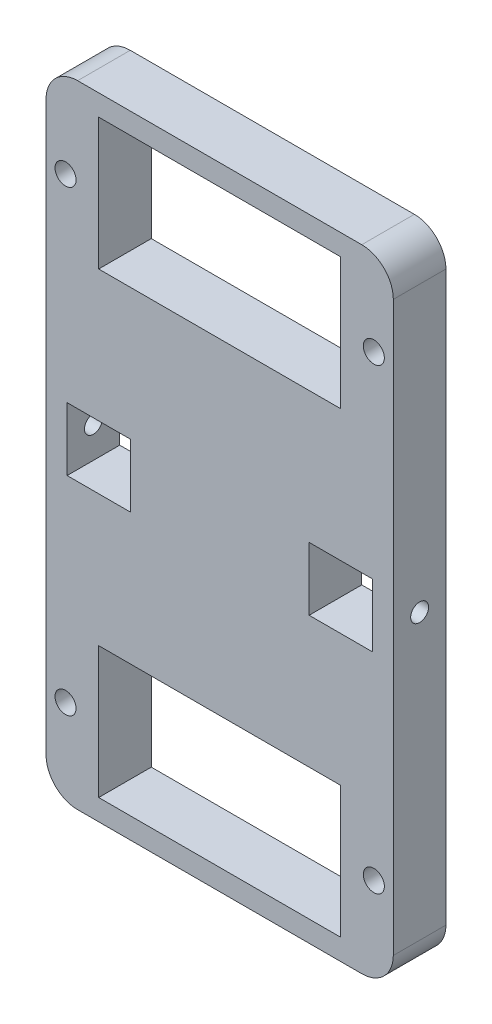
ISO-10303-21;
HEADER;
FILE_DESCRIPTION(('STEP AP214'),'2;1');
FILE_NAME('part.step','',(''),(''),'','','');
FILE_SCHEMA(('AUTOMOTIVE_DESIGN { 1 0 10303 214 1 1 1 1 }'));
ENDSEC;
DATA;
#1=APPLICATION_CONTEXT('core data for automotive mechanical design processes');
#2=APPLICATION_PROTOCOL_DEFINITION('international standard','automotive_design',2000,#1);
#3=PRODUCT_CONTEXT('',#1,'mechanical');
#4=PRODUCT('Part','Part','',(#3));
#5=PRODUCT_RELATED_PRODUCT_CATEGORY('part','',(#4));
#6=PRODUCT_DEFINITION_FORMATION('','',#4);
#7=PRODUCT_DEFINITION_CONTEXT('part definition',#1,'design');
#8=PRODUCT_DEFINITION('design','',#6,#7);
#9=PRODUCT_DEFINITION_SHAPE('','',#8);
#10=(LENGTH_UNIT() NAMED_UNIT(*) SI_UNIT(.MILLI.,.METRE.));
#11=(NAMED_UNIT(*) PLANE_ANGLE_UNIT() SI_UNIT($,.RADIAN.));
#12=(NAMED_UNIT(*) SI_UNIT($,.STERADIAN.) SOLID_ANGLE_UNIT());
#13=UNCERTAINTY_MEASURE_WITH_UNIT(LENGTH_MEASURE(1.E-05),#10,'distance_accuracy_value','');
#14=(GEOMETRIC_REPRESENTATION_CONTEXT(3) GLOBAL_UNCERTAINTY_ASSIGNED_CONTEXT((#13)) GLOBAL_UNIT_ASSIGNED_CONTEXT((#10,
#11,#12)) REPRESENTATION_CONTEXT('',''));
#15=CARTESIAN_POINT('',(0.,0.,0.));
#16=DIRECTION('',(0.,0.,1.));
#17=DIRECTION('',(1.,0.,0.));
#18=AXIS2_PLACEMENT_3D('',#15,#16,#17);
#19=CARTESIAN_POINT('',(0.,0.,5.));
#20=DIRECTION('',(0.,0.,-1.));
#21=DIRECTION('',(-1.,0.,0.));
#22=AXIS2_PLACEMENT_3D('',#19,#20,#21);
#23=PLANE('',#22);
#24=DIRECTION('',(0.,1.,0.));
#25=VECTOR('',#24,1.);
#26=CARTESIAN_POINT('',(-8.5,-3.,5.));
#27=LINE('',#26,#25);
#28=CARTESIAN_POINT('',(-8.5,-3.,5.));
#29=VERTEX_POINT('',#28);
#30=CARTESIAN_POINT('',(-8.5,3.,5.));
#31=VERTEX_POINT('',#30);
#32=EDGE_CURVE('E258',#29,#31,#27,.T.);
#33=ORIENTED_EDGE('',*,*,#32,.F.);
#34=DIRECTION('',(1.,0.,0.));
#35=VECTOR('',#34,1.);
#36=CARTESIAN_POINT('',(-14.5,-3.,5.));
#37=LINE('',#36,#35);
#38=CARTESIAN_POINT('',(-14.5,-3.,5.));
#39=VERTEX_POINT('',#38);
#40=EDGE_CURVE('E269',#39,#29,#37,.T.);
#41=ORIENTED_EDGE('',*,*,#40,.F.);
#42=DIRECTION('',(0.,-1.,0.));
#43=VECTOR('',#42,1.);
#44=CARTESIAN_POINT('',(-14.5,-3.,5.));
#45=LINE('',#44,#43);
#46=CARTESIAN_POINT('',(-14.5,3.,5.));
#47=VERTEX_POINT('',#46);
#48=EDGE_CURVE('E265',#47,#39,#45,.T.);
#49=ORIENTED_EDGE('',*,*,#48,.F.);
#50=DIRECTION('',(-1.,0.,0.));
#51=VECTOR('',#50,1.);
#52=CARTESIAN_POINT('',(-14.5,3.,5.));
#53=LINE('',#52,#51);
#54=EDGE_CURVE('E261',#31,#47,#53,.T.);
#55=ORIENTED_EDGE('',*,*,#54,.F.);
#56=EDGE_LOOP('',(#33,#41,#49,#55));
#57=FACE_BOUND('',#56,.T.);
#58=DIRECTION('',(0.,1.,0.));
#59=VECTOR('',#58,1.);
#60=CARTESIAN_POINT('',(11.5,28.,5.));
#61=LINE('',#60,#59);
#62=CARTESIAN_POINT('',(11.5,15.5,5.));
#63=VERTEX_POINT('',#62);
#64=CARTESIAN_POINT('',(11.5,28.,5.));
#65=VERTEX_POINT('',#64);
#66=EDGE_CURVE('E376',#63,#65,#61,.T.);
#67=ORIENTED_EDGE('',*,*,#66,.F.);
#68=DIRECTION('',(1.,0.,0.));
#69=VECTOR('',#68,1.);
#70=CARTESIAN_POINT('',(-11.5,15.5,5.));
#71=LINE('',#70,#69);
#72=CARTESIAN_POINT('',(-11.5,15.5,5.));
#73=VERTEX_POINT('',#72);
#74=EDGE_CURVE('E387',#73,#63,#71,.T.);
#75=ORIENTED_EDGE('',*,*,#74,.F.);
#76=DIRECTION('',(0.,-1.,0.));
#77=VECTOR('',#76,1.);
#78=CARTESIAN_POINT('',(-11.5,28.,5.));
#79=LINE('',#78,#77);
#80=CARTESIAN_POINT('',(-11.5,28.,5.));
#81=VERTEX_POINT('',#80);
#82=EDGE_CURVE('E383',#81,#73,#79,.T.);
#83=ORIENTED_EDGE('',*,*,#82,.F.);
#84=DIRECTION('',(-1.,0.,0.));
#85=VECTOR('',#84,1.);
#86=CARTESIAN_POINT('',(-11.5,28.,5.));
#87=LINE('',#86,#85);
#88=EDGE_CURVE('E379',#65,#81,#87,.T.);
#89=ORIENTED_EDGE('',*,*,#88,.F.);
#90=EDGE_LOOP('',(#67,#75,#83,#89));
#91=FACE_BOUND('',#90,.T.);
#92=DIRECTION('',(1.,0.,0.));
#93=VECTOR('',#92,1.);
#94=CARTESIAN_POINT('',(-16.5,-30.,5.));
#95=LINE('',#94,#93);
#96=CARTESIAN_POINT('',(-13.5,-30.,5.));
#97=VERTEX_POINT('',#96);
#98=CARTESIAN_POINT('',(13.5,-30.,5.));
#99=VERTEX_POINT('',#98);
#100=EDGE_CURVE('E430',#97,#99,#95,.T.);
#101=ORIENTED_EDGE('',*,*,#100,.T.);
#102=CARTESIAN_POINT('',(13.5,-27.,5.));
#103=DIRECTION('',(0.,0.,-1.));
#104=DIRECTION('',(-1.,0.,0.));
#105=AXIS2_PLACEMENT_3D('',#102,#103,#104);
#106=CIRCLE('',#105,3.);
#107=CARTESIAN_POINT('',(16.5,-27.,5.));
#108=VERTEX_POINT('',#107);
#109=EDGE_CURVE('E490',#99,#108,#106,.F.);
#110=ORIENTED_EDGE('',*,*,#109,.T.);
#111=DIRECTION('',(0.,1.,0.));
#112=VECTOR('',#111,1.);
#113=CARTESIAN_POINT('',(16.5,-30.,5.));
#114=LINE('',#113,#112);
#115=CARTESIAN_POINT('',(16.5,27.,5.));
#116=VERTEX_POINT('',#115);
#117=EDGE_CURVE('E419',#108,#116,#114,.T.);
#118=ORIENTED_EDGE('',*,*,#117,.T.);
#119=CARTESIAN_POINT('',(13.5,27.,5.));
#120=DIRECTION('',(0.,0.,-1.));
#121=DIRECTION('',(-1.,0.,0.));
#122=AXIS2_PLACEMENT_3D('',#119,#120,#121);
#123=CIRCLE('',#122,3.);
#124=CARTESIAN_POINT('',(13.5,30.,5.));
#125=VERTEX_POINT('',#124);
#126=EDGE_CURVE('E487',#116,#125,#123,.F.);
#127=ORIENTED_EDGE('',*,*,#126,.T.);
#128=DIRECTION('',(-1.,0.,0.));
#129=VECTOR('',#128,1.);
#130=CARTESIAN_POINT('',(-16.5,30.,5.));
#131=LINE('',#130,#129);
#132=CARTESIAN_POINT('',(-13.5,30.,5.));
#133=VERTEX_POINT('',#132);
#134=EDGE_CURVE('E423',#125,#133,#131,.T.);
#135=ORIENTED_EDGE('',*,*,#134,.T.);
#136=CARTESIAN_POINT('',(-13.5,27.,5.));
#137=DIRECTION('',(0.,0.,-1.));
#138=DIRECTION('',(-1.,0.,0.));
#139=AXIS2_PLACEMENT_3D('',#136,#137,#138);
#140=CIRCLE('',#139,3.);
#141=CARTESIAN_POINT('',(-16.5,27.,5.));
#142=VERTEX_POINT('',#141);
#143=EDGE_CURVE('E61',#133,#142,#140,.F.);
#144=ORIENTED_EDGE('',*,*,#143,.T.);
#145=DIRECTION('',(0.,-1.,0.));
#146=VECTOR('',#145,1.);
#147=CARTESIAN_POINT('',(-16.5,-30.,5.));
#148=LINE('',#147,#146);
#149=CARTESIAN_POINT('',(-16.5,-27.,5.));
#150=VERTEX_POINT('',#149);
#151=EDGE_CURVE('E427',#142,#150,#148,.T.);
#152=ORIENTED_EDGE('',*,*,#151,.T.);
#153=CARTESIAN_POINT('',(-13.5,-27.,5.));
#154=DIRECTION('',(0.,0.,-1.));
#155=DIRECTION('',(-1.,0.,0.));
#156=AXIS2_PLACEMENT_3D('',#153,#154,#155);
#157=CIRCLE('',#156,3.);
#158=EDGE_CURVE('E482',#150,#97,#157,.F.);
#159=ORIENTED_EDGE('',*,*,#158,.T.);
#160=EDGE_LOOP('',(#101,#110,#118,#127,#135,#144,#152,#159));
#161=FACE_BOUND('',#160,.T.);
#162=DIRECTION('',(0.,-1.,0.));
#163=VECTOR('',#162,1.);
#164=CARTESIAN_POINT('',(-11.5,-28.,5.));
#165=LINE('',#164,#163);
#166=CARTESIAN_POINT('',(-11.5,-15.5,5.));
#167=VERTEX_POINT('',#166);
#168=CARTESIAN_POINT('',(-11.5,-28.,5.));
#169=VERTEX_POINT('',#168);
#170=EDGE_CURVE('E333',#167,#169,#165,.T.);
#171=ORIENTED_EDGE('',*,*,#170,.F.);
#172=DIRECTION('',(-1.,0.,0.));
#173=VECTOR('',#172,1.);
#174=CARTESIAN_POINT('',(-11.5,-15.5,5.));
#175=LINE('',#174,#173);
#176=CARTESIAN_POINT('',(11.5,-15.5,5.));
#177=VERTEX_POINT('',#176);
#178=EDGE_CURVE('E344',#177,#167,#175,.T.);
#179=ORIENTED_EDGE('',*,*,#178,.F.);
#180=DIRECTION('',(0.,1.,0.));
#181=VECTOR('',#180,1.);
#182=CARTESIAN_POINT('',(11.5,-28.,5.));
#183=LINE('',#182,#181);
#184=CARTESIAN_POINT('',(11.5,-28.,5.));
#185=VERTEX_POINT('',#184);
#186=EDGE_CURVE('E340',#185,#177,#183,.T.);
#187=ORIENTED_EDGE('',*,*,#186,.F.);
#188=DIRECTION('',(1.,0.,0.));
#189=VECTOR('',#188,1.);
#190=CARTESIAN_POINT('',(-11.5,-28.,5.));
#191=LINE('',#190,#189);
#192=EDGE_CURVE('E336',#169,#185,#191,.T.);
#193=ORIENTED_EDGE('',*,*,#192,.F.);
#194=EDGE_LOOP('',(#171,#179,#187,#193));
#195=FACE_BOUND('',#194,.T.);
#196=CARTESIAN_POINT('',(-14.65,21.75,5.));
#197=DIRECTION('',(0.,0.,1.));
#198=DIRECTION('',(1.,0.,0.));
#199=AXIS2_PLACEMENT_3D('',#196,#197,#198);
#200=CIRCLE('',#199,1.);
#201=CARTESIAN_POINT('',(-13.65,21.75,5.));
#202=VERTEX_POINT('',#201);
#203=EDGE_CURVE('E325',#202,#202,#200,.T.);
#204=ORIENTED_EDGE('',*,*,#203,.F.);
#205=EDGE_LOOP('',(#204));
#206=FACE_BOUND('',#205,.T.);
#207=CARTESIAN_POINT('',(14.65,21.75,5.));
#208=DIRECTION('',(0.,0.,1.));
#209=DIRECTION('',(-1.,0.,0.));
#210=AXIS2_PLACEMENT_3D('',#207,#208,#209);
#211=CIRCLE('',#210,1.);
#212=CARTESIAN_POINT('',(13.65,21.75,5.));
#213=VERTEX_POINT('',#212);
#214=EDGE_CURVE('E317',#213,#213,#211,.T.);
#215=ORIENTED_EDGE('',*,*,#214,.F.);
#216=EDGE_LOOP('',(#215));
#217=FACE_BOUND('',#216,.T.);
#218=CARTESIAN_POINT('',(14.65,-21.75,5.));
#219=DIRECTION('',(0.,0.,1.));
#220=DIRECTION('',(1.,0.,0.));
#221=AXIS2_PLACEMENT_3D('',#218,#219,#220);
#222=CIRCLE('',#221,1.);
#223=CARTESIAN_POINT('',(15.65,-21.75,5.));
#224=VERTEX_POINT('',#223);
#225=EDGE_CURVE('E309',#224,#224,#222,.T.);
#226=ORIENTED_EDGE('',*,*,#225,.F.);
#227=EDGE_LOOP('',(#226));
#228=FACE_BOUND('',#227,.T.);
#229=CARTESIAN_POINT('',(-14.65,-21.75,5.));
#230=DIRECTION('',(0.,0.,1.));
#231=DIRECTION('',(-1.,0.,0.));
#232=AXIS2_PLACEMENT_3D('',#229,#230,#231);
#233=CIRCLE('',#232,1.);
#234=CARTESIAN_POINT('',(-15.65,-21.75,5.));
#235=VERTEX_POINT('',#234);
#236=EDGE_CURVE('E301',#235,#235,#233,.T.);
#237=ORIENTED_EDGE('',*,*,#236,.F.);
#238=EDGE_LOOP('',(#237));
#239=FACE_BOUND('',#238,.T.);
#240=DIRECTION('',(0.,1.,0.));
#241=VECTOR('',#240,1.);
#242=CARTESIAN_POINT('',(14.5,-3.,5.));
#243=LINE('',#242,#241);
#244=CARTESIAN_POINT('',(14.5,-3.,5.));
#245=VERTEX_POINT('',#244);
#246=CARTESIAN_POINT('',(14.5,3.,5.));
#247=VERTEX_POINT('',#246);
#248=EDGE_CURVE('E203',#245,#247,#243,.T.);
#249=ORIENTED_EDGE('',*,*,#248,.F.);
#250=DIRECTION('',(1.,0.,0.));
#251=VECTOR('',#250,1.);
#252=CARTESIAN_POINT('',(14.5,-3.,5.));
#253=LINE('',#252,#251);
#254=CARTESIAN_POINT('',(8.50000000000001,-3.,5.));
#255=VERTEX_POINT('',#254);
#256=EDGE_CURVE('E232',#255,#245,#253,.T.);
#257=ORIENTED_EDGE('',*,*,#256,.F.);
#258=DIRECTION('',(0.,-1.,0.));
#259=VECTOR('',#258,1.);
#260=CARTESIAN_POINT('',(8.50000000000001,-3.,5.));
#261=LINE('',#260,#259);
#262=CARTESIAN_POINT('',(8.50000000000001,3.,5.));
#263=VERTEX_POINT('',#262);
#264=EDGE_CURVE('E228',#263,#255,#261,.T.);
#265=ORIENTED_EDGE('',*,*,#264,.F.);
#266=DIRECTION('',(-1.,0.,0.));
#267=VECTOR('',#266,1.);
#268=CARTESIAN_POINT('',(14.5,3.,5.));
#269=LINE('',#268,#267);
#270=EDGE_CURVE('E214',#247,#263,#269,.T.);
#271=ORIENTED_EDGE('',*,*,#270,.F.);
#272=EDGE_LOOP('',(#249,#257,#265,#271));
#273=FACE_BOUND('',#272,.T.);
#274=ADVANCED_FACE('F39',(#57,#91,#161,#195,#206,#217,#228,#239,#273),#23,.F.);
#275=CARTESIAN_POINT('',(0.,0.,0.));
#276=DIRECTION('',(0.,0.,-1.));
#277=DIRECTION('',(-1.,0.,0.));
#278=AXIS2_PLACEMENT_3D('',#275,#276,#277);
#279=PLANE('',#278);
#280=CARTESIAN_POINT('',(14.65,-21.75,0.));
#281=DIRECTION('',(0.,0.,1.));
#282=DIRECTION('',(1.,0.,0.));
#283=AXIS2_PLACEMENT_3D('',#280,#281,#282);
#284=CIRCLE('',#283,1.);
#285=CARTESIAN_POINT('',(15.65,-21.75,0.));
#286=VERTEX_POINT('',#285);
#287=EDGE_CURVE('E305',#286,#286,#284,.T.);
#288=ORIENTED_EDGE('',*,*,#287,.T.);
#289=EDGE_LOOP('',(#288));
#290=FACE_BOUND('',#289,.T.);
#291=CARTESIAN_POINT('',(-14.65,21.75,0.));
#292=DIRECTION('',(0.,0.,1.));
#293=DIRECTION('',(1.,0.,0.));
#294=AXIS2_PLACEMENT_3D('',#291,#292,#293);
#295=CIRCLE('',#294,1.);
#296=CARTESIAN_POINT('',(-13.65,21.75,0.));
#297=VERTEX_POINT('',#296);
#298=EDGE_CURVE('E321',#297,#297,#295,.T.);
#299=ORIENTED_EDGE('',*,*,#298,.T.);
#300=EDGE_LOOP('',(#299));
#301=FACE_BOUND('',#300,.T.);
#302=DIRECTION('',(0.,1.,0.));
#303=VECTOR('',#302,1.);
#304=CARTESIAN_POINT('',(16.5,-30.,0.));
#305=LINE('',#304,#303);
#306=CARTESIAN_POINT('',(16.5,-27.,0.));
#307=VERTEX_POINT('',#306);
#308=CARTESIAN_POINT('',(16.5,27.,0.));
#309=VERTEX_POINT('',#308);
#310=EDGE_CURVE('E418',#307,#309,#305,.T.);
#311=ORIENTED_EDGE('',*,*,#310,.F.);
#312=CARTESIAN_POINT('',(13.5,-27.,0.));
#313=DIRECTION('',(0.,0.,-1.));
#314=DIRECTION('',(-1.,0.,0.));
#315=AXIS2_PLACEMENT_3D('',#312,#313,#314);
#316=CIRCLE('',#315,3.);
#317=CARTESIAN_POINT('',(13.5,-30.,0.));
#318=VERTEX_POINT('',#317);
#319=EDGE_CURVE('E472',#307,#318,#316,.T.);
#320=ORIENTED_EDGE('',*,*,#319,.T.);
#321=DIRECTION('',(1.,0.,0.));
#322=VECTOR('',#321,1.);
#323=CARTESIAN_POINT('',(-16.5,-30.,0.));
#324=LINE('',#323,#322);
#325=CARTESIAN_POINT('',(-13.5,-30.,0.));
#326=VERTEX_POINT('',#325);
#327=EDGE_CURVE('E424',#326,#318,#324,.T.);
#328=ORIENTED_EDGE('',*,*,#327,.F.);
#329=CARTESIAN_POINT('',(-13.5,-27.,0.));
#330=DIRECTION('',(0.,0.,-1.));
#331=DIRECTION('',(-1.,0.,0.));
#332=AXIS2_PLACEMENT_3D('',#329,#330,#331);
#333=CIRCLE('',#332,3.);
#334=CARTESIAN_POINT('',(-16.5,-27.,0.));
#335=VERTEX_POINT('',#334);
#336=EDGE_CURVE('E463',#326,#335,#333,.T.);
#337=ORIENTED_EDGE('',*,*,#336,.T.);
#338=DIRECTION('',(0.,-1.,0.));
#339=VECTOR('',#338,1.);
#340=CARTESIAN_POINT('',(-16.5,-30.,0.));
#341=LINE('',#340,#339);
#342=CARTESIAN_POINT('',(-16.5,27.,0.));
#343=VERTEX_POINT('',#342);
#344=EDGE_CURVE('E442',#343,#335,#341,.T.);
#345=ORIENTED_EDGE('',*,*,#344,.F.);
#346=CARTESIAN_POINT('',(-13.5,27.,0.));
#347=DIRECTION('',(0.,0.,-1.));
#348=DIRECTION('',(-1.,0.,0.));
#349=AXIS2_PLACEMENT_3D('',#346,#347,#348);
#350=CIRCLE('',#349,3.);
#351=CARTESIAN_POINT('',(-13.5,30.,0.));
#352=VERTEX_POINT('',#351);
#353=EDGE_CURVE('E466',#343,#352,#350,.T.);
#354=ORIENTED_EDGE('',*,*,#353,.T.);
#355=DIRECTION('',(-1.,0.,0.));
#356=VECTOR('',#355,1.);
#357=CARTESIAN_POINT('',(-16.5,30.,0.));
#358=LINE('',#357,#356);
#359=CARTESIAN_POINT('',(13.5,30.,0.));
#360=VERTEX_POINT('',#359);
#361=EDGE_CURVE('E438',#360,#352,#358,.T.);
#362=ORIENTED_EDGE('',*,*,#361,.F.);
#363=CARTESIAN_POINT('',(13.5,27.,0.));
#364=DIRECTION('',(0.,0.,-1.));
#365=DIRECTION('',(-1.,0.,0.));
#366=AXIS2_PLACEMENT_3D('',#363,#364,#365);
#367=CIRCLE('',#366,3.);
#368=EDGE_CURVE('E469',#360,#309,#367,.T.);
#369=ORIENTED_EDGE('',*,*,#368,.T.);
#370=EDGE_LOOP('',(#311,#320,#328,#337,#345,#354,#362,#369));
#371=FACE_BOUND('',#370,.T.);
#372=DIRECTION('',(1.,0.,0.));
#373=VECTOR('',#372,1.);
#374=CARTESIAN_POINT('',(-11.5,15.5,0.));
#375=LINE('',#374,#373);
#376=CARTESIAN_POINT('',(-11.5,15.5,0.));
#377=VERTEX_POINT('',#376);
#378=CARTESIAN_POINT('',(11.5,15.5,0.));
#379=VERTEX_POINT('',#378);
#380=EDGE_CURVE('E380',#377,#379,#375,.T.);
#381=ORIENTED_EDGE('',*,*,#380,.T.);
#382=DIRECTION('',(0.,1.,0.));
#383=VECTOR('',#382,1.);
#384=CARTESIAN_POINT('',(11.5,28.,0.));
#385=LINE('',#384,#383);
#386=CARTESIAN_POINT('',(11.5,28.,0.));
#387=VERTEX_POINT('',#386);
#388=EDGE_CURVE('E375',#379,#387,#385,.T.);
#389=ORIENTED_EDGE('',*,*,#388,.T.);
#390=DIRECTION('',(-1.,0.,0.));
#391=VECTOR('',#390,1.);
#392=CARTESIAN_POINT('',(-11.5,28.,0.));
#393=LINE('',#392,#391);
#394=CARTESIAN_POINT('',(-11.5,28.,0.));
#395=VERTEX_POINT('',#394);
#396=EDGE_CURVE('E394',#387,#395,#393,.T.);
#397=ORIENTED_EDGE('',*,*,#396,.T.);
#398=DIRECTION('',(0.,-1.,0.));
#399=VECTOR('',#398,1.);
#400=CARTESIAN_POINT('',(-11.5,28.,0.));
#401=LINE('',#400,#399);
#402=EDGE_CURVE('E398',#395,#377,#401,.T.);
#403=ORIENTED_EDGE('',*,*,#402,.T.);
#404=EDGE_LOOP('',(#381,#389,#397,#403));
#405=FACE_BOUND('',#404,.T.);
#406=DIRECTION('',(-1.,0.,0.));
#407=VECTOR('',#406,1.);
#408=CARTESIAN_POINT('',(-11.5,-15.5,0.));
#409=LINE('',#408,#407);
#410=CARTESIAN_POINT('',(11.5,-15.5,0.));
#411=VERTEX_POINT('',#410);
#412=CARTESIAN_POINT('',(-11.5,-15.5,0.));
#413=VERTEX_POINT('',#412);
#414=EDGE_CURVE('E337',#411,#413,#409,.T.);
#415=ORIENTED_EDGE('',*,*,#414,.T.);
#416=DIRECTION('',(0.,-1.,0.));
#417=VECTOR('',#416,1.);
#418=CARTESIAN_POINT('',(-11.5,-28.,0.));
#419=LINE('',#418,#417);
#420=CARTESIAN_POINT('',(-11.5,-28.,0.));
#421=VERTEX_POINT('',#420);
#422=EDGE_CURVE('E329',#413,#421,#419,.T.);
#423=ORIENTED_EDGE('',*,*,#422,.T.);
#424=DIRECTION('',(1.,0.,0.));
#425=VECTOR('',#424,1.);
#426=CARTESIAN_POINT('',(-11.5,-28.,0.));
#427=LINE('',#426,#425);
#428=CARTESIAN_POINT('',(11.5,-28.,0.));
#429=VERTEX_POINT('',#428);
#430=EDGE_CURVE('E351',#421,#429,#427,.T.);
#431=ORIENTED_EDGE('',*,*,#430,.T.);
#432=DIRECTION('',(0.,1.,0.));
#433=VECTOR('',#432,1.);
#434=CARTESIAN_POINT('',(11.5,-28.,0.));
#435=LINE('',#434,#433);
#436=EDGE_CURVE('E355',#429,#411,#435,.T.);
#437=ORIENTED_EDGE('',*,*,#436,.T.);
#438=EDGE_LOOP('',(#415,#423,#431,#437));
#439=FACE_BOUND('',#438,.T.);
#440=CARTESIAN_POINT('',(14.65,21.75,0.));
#441=DIRECTION('',(0.,0.,1.));
#442=DIRECTION('',(-1.,0.,0.));
#443=AXIS2_PLACEMENT_3D('',#440,#441,#442);
#444=CIRCLE('',#443,1.);
#445=CARTESIAN_POINT('',(13.65,21.75,0.));
#446=VERTEX_POINT('',#445);
#447=EDGE_CURVE('E313',#446,#446,#444,.T.);
#448=ORIENTED_EDGE('',*,*,#447,.T.);
#449=EDGE_LOOP('',(#448));
#450=FACE_BOUND('',#449,.T.);
#451=CARTESIAN_POINT('',(-14.65,-21.75,0.));
#452=DIRECTION('',(0.,0.,1.));
#453=DIRECTION('',(-1.,0.,0.));
#454=AXIS2_PLACEMENT_3D('',#451,#452,#453);
#455=CIRCLE('',#454,1.);
#456=CARTESIAN_POINT('',(-15.65,-21.75,0.));
#457=VERTEX_POINT('',#456);
#458=EDGE_CURVE('E300',#457,#457,#455,.T.);
#459=ORIENTED_EDGE('',*,*,#458,.T.);
#460=EDGE_LOOP('',(#459));
#461=FACE_BOUND('',#460,.T.);
#462=DIRECTION('',(1.,0.,0.));
#463=VECTOR('',#462,1.);
#464=CARTESIAN_POINT('',(-14.5,-3.,0.));
#465=LINE('',#464,#463);
#466=CARTESIAN_POINT('',(-14.5,-3.,0.));
#467=VERTEX_POINT('',#466);
#468=CARTESIAN_POINT('',(-8.5,-3.,0.));
#469=VERTEX_POINT('',#468);
#470=EDGE_CURVE('E262',#467,#469,#465,.T.);
#471=ORIENTED_EDGE('',*,*,#470,.T.);
#472=DIRECTION('',(0.,1.,0.));
#473=VECTOR('',#472,1.);
#474=CARTESIAN_POINT('',(-8.5,-3.,0.));
#475=LINE('',#474,#473);
#476=CARTESIAN_POINT('',(-8.5,3.,0.));
#477=VERTEX_POINT('',#476);
#478=EDGE_CURVE('E223',#469,#477,#475,.T.);
#479=ORIENTED_EDGE('',*,*,#478,.T.);
#480=DIRECTION('',(-1.,0.,0.));
#481=VECTOR('',#480,1.);
#482=CARTESIAN_POINT('',(-14.5,3.,0.));
#483=LINE('',#482,#481);
#484=CARTESIAN_POINT('',(-14.5,3.,0.));
#485=VERTEX_POINT('',#484);
#486=EDGE_CURVE('E276',#477,#485,#483,.T.);
#487=ORIENTED_EDGE('',*,*,#486,.T.);
#488=DIRECTION('',(0.,-1.,0.));
#489=VECTOR('',#488,1.);
#490=CARTESIAN_POINT('',(-14.5,-3.,0.));
#491=LINE('',#490,#489);
#492=EDGE_CURVE('E280',#485,#467,#491,.T.);
#493=ORIENTED_EDGE('',*,*,#492,.T.);
#494=EDGE_LOOP('',(#471,#479,#487,#493));
#495=FACE_BOUND('',#494,.T.);
#496=DIRECTION('',(1.,0.,0.));
#497=VECTOR('',#496,1.);
#498=CARTESIAN_POINT('',(14.5,-3.,0.));
#499=LINE('',#498,#497);
#500=CARTESIAN_POINT('',(8.50000000000001,-3.,0.));
#501=VERTEX_POINT('',#500);
#502=CARTESIAN_POINT('',(14.5,-3.,0.));
#503=VERTEX_POINT('',#502);
#504=EDGE_CURVE('E215',#501,#503,#499,.T.);
#505=ORIENTED_EDGE('',*,*,#504,.T.);
#506=DIRECTION('',(0.,1.,0.));
#507=VECTOR('',#506,1.);
#508=CARTESIAN_POINT('',(14.5,-3.,0.));
#509=LINE('',#508,#507);
#510=CARTESIAN_POINT('',(14.5,3.,0.));
#511=VERTEX_POINT('',#510);
#512=EDGE_CURVE('E238',#503,#511,#509,.T.);
#513=ORIENTED_EDGE('',*,*,#512,.T.);
#514=DIRECTION('',(-1.,0.,0.));
#515=VECTOR('',#514,1.);
#516=CARTESIAN_POINT('',(14.5,3.,0.));
#517=LINE('',#516,#515);
#518=CARTESIAN_POINT('',(8.50000000000001,3.,0.));
#519=VERTEX_POINT('',#518);
#520=EDGE_CURVE('E221',#511,#519,#517,.T.);
#521=ORIENTED_EDGE('',*,*,#520,.T.);
#522=DIRECTION('',(0.,-1.,0.));
#523=VECTOR('',#522,1.);
#524=CARTESIAN_POINT('',(8.50000000000001,-3.,0.));
#525=LINE('',#524,#523);
#526=EDGE_CURVE('E244',#519,#501,#525,.T.);
#527=ORIENTED_EDGE('',*,*,#526,.T.);
#528=EDGE_LOOP('',(#505,#513,#521,#527));
#529=FACE_BOUND('',#528,.T.);
#530=ADVANCED_FACE('F510',(#290,#301,#371,#405,#439,#450,#461,#495,#529),#279,.T.);
#531=CARTESIAN_POINT('',(16.5,-30.,5.));
#532=DIRECTION('',(-1.,0.,0.));
#533=DIRECTION('',(0.,0.,1.));
#534=AXIS2_PLACEMENT_3D('',#531,#532,#533);
#535=PLANE('',#534);
#536=CARTESIAN_POINT('',(16.5,0.,2.5));
#537=DIRECTION('',(1.,0.,0.));
#538=DIRECTION('',(0.,0.,-1.));
#539=AXIS2_PLACEMENT_3D('',#536,#537,#538);
#540=CIRCLE('',#539,0.85);
#541=CARTESIAN_POINT('',(16.5,0.,1.65));
#542=VERTEX_POINT('',#541);
#543=EDGE_CURVE('E451',#542,#542,#540,.T.);
#544=ORIENTED_EDGE('',*,*,#543,.F.);
#545=EDGE_LOOP('',(#544));
#546=FACE_BOUND('',#545,.T.);
#547=ORIENTED_EDGE('',*,*,#117,.F.);
#548=DIRECTION('',(0.,0.,-1.));
#549=VECTOR('',#548,1.);
#550=CARTESIAN_POINT('',(16.5,-27.,5.));
#551=LINE('',#550,#549);
#552=EDGE_CURVE('E459',#108,#307,#551,.T.);
#553=ORIENTED_EDGE('',*,*,#552,.T.);
#554=ORIENTED_EDGE('',*,*,#310,.T.);
#555=DIRECTION('',(0.,0.,-1.));
#556=VECTOR('',#555,1.);
#557=CARTESIAN_POINT('',(16.5,27.,5.));
#558=LINE('',#557,#556);
#559=EDGE_CURVE('E434',#309,#116,#558,.F.);
#560=ORIENTED_EDGE('',*,*,#559,.T.);
#561=EDGE_LOOP('',(#547,#553,#554,#560));
#562=FACE_BOUND('',#561,.T.);
#563=ADVANCED_FACE('F532',(#546,#562),#535,.F.);
#564=CARTESIAN_POINT('',(-16.5,30.,5.));
#565=DIRECTION('',(0.,-1.,0.));
#566=DIRECTION('',(1.,0.,0.));
#567=AXIS2_PLACEMENT_3D('',#564,#565,#566);
#568=PLANE('',#567);
#569=ORIENTED_EDGE('',*,*,#134,.F.);
#570=DIRECTION('',(0.,0.,-1.));
#571=VECTOR('',#570,1.);
#572=CARTESIAN_POINT('',(13.5,30.,5.));
#573=LINE('',#572,#571);
#574=EDGE_CURVE('E496',#125,#360,#573,.T.);
#575=ORIENTED_EDGE('',*,*,#574,.T.);
#576=ORIENTED_EDGE('',*,*,#361,.T.);
#577=DIRECTION('',(0.,0.,-1.));
#578=VECTOR('',#577,1.);
#579=CARTESIAN_POINT('',(-13.5,30.,5.));
#580=LINE('',#579,#578);
#581=EDGE_CURVE('E493',#352,#133,#580,.F.);
#582=ORIENTED_EDGE('',*,*,#581,.T.);
#583=EDGE_LOOP('',(#569,#575,#576,#582));
#584=FACE_BOUND('',#583,.T.);
#585=ADVANCED_FACE('F504',(#584),#568,.F.);
#586=CARTESIAN_POINT('',(-16.5,-30.,5.));
#587=DIRECTION('',(1.,0.,0.));
#588=DIRECTION('',(0.,0.,-1.));
#589=AXIS2_PLACEMENT_3D('',#586,#587,#588);
#590=PLANE('',#589);
#591=CARTESIAN_POINT('',(-16.5,0.,2.5));
#592=DIRECTION('',(-1.,0.,0.));
#593=DIRECTION('',(0.,0.,1.));
#594=AXIS2_PLACEMENT_3D('',#591,#592,#593);
#595=CIRCLE('',#594,0.85);
#596=CARTESIAN_POINT('',(-16.5,0.,3.35));
#597=VERTEX_POINT('',#596);
#598=EDGE_CURVE('E456',#597,#597,#595,.T.);
#599=ORIENTED_EDGE('',*,*,#598,.F.);
#600=EDGE_LOOP('',(#599));
#601=FACE_BOUND('',#600,.T.);
#602=ORIENTED_EDGE('',*,*,#151,.F.);
#603=DIRECTION('',(0.,0.,-1.));
#604=VECTOR('',#603,1.);
#605=CARTESIAN_POINT('',(-16.5,27.,5.));
#606=LINE('',#605,#604);
#607=EDGE_CURVE('E11',#142,#343,#606,.T.);
#608=ORIENTED_EDGE('',*,*,#607,.T.);
#609=ORIENTED_EDGE('',*,*,#344,.T.);
#610=DIRECTION('',(0.,0.,-1.));
#611=VECTOR('',#610,1.);
#612=CARTESIAN_POINT('',(-16.5,-27.,5.));
#613=LINE('',#612,#611);
#614=EDGE_CURVE('E48',#335,#150,#613,.F.);
#615=ORIENTED_EDGE('',*,*,#614,.T.);
#616=EDGE_LOOP('',(#602,#608,#609,#615));
#617=FACE_BOUND('',#616,.T.);
#618=ADVANCED_FACE('F516',(#601,#617),#590,.F.);
#619=CARTESIAN_POINT('',(-16.5,-30.,5.));
#620=DIRECTION('',(0.,1.,0.));
#621=DIRECTION('',(-1.,0.,0.));
#622=AXIS2_PLACEMENT_3D('',#619,#620,#621);
#623=PLANE('',#622);
#624=ORIENTED_EDGE('',*,*,#327,.T.);
#625=DIRECTION('',(0.,0.,-1.));
#626=VECTOR('',#625,1.);
#627=CARTESIAN_POINT('',(13.5,-30.,5.));
#628=LINE('',#627,#626);
#629=EDGE_CURVE('E479',#318,#99,#628,.F.);
#630=ORIENTED_EDGE('',*,*,#629,.T.);
#631=ORIENTED_EDGE('',*,*,#100,.F.);
#632=DIRECTION('',(0.,0.,-1.));
#633=VECTOR('',#632,1.);
#634=CARTESIAN_POINT('',(-13.5,-30.,5.));
#635=LINE('',#634,#633);
#636=EDGE_CURVE('E475',#97,#326,#635,.T.);
#637=ORIENTED_EDGE('',*,*,#636,.T.);
#638=EDGE_LOOP('',(#624,#630,#631,#637));
#639=FACE_BOUND('',#638,.T.);
#640=ADVANCED_FACE('F524',(#639),#623,.F.);
#641=CARTESIAN_POINT('',(11.5,28.,5.));
#642=DIRECTION('',(-1.,0.,0.));
#643=DIRECTION('',(0.,-1.,0.));
#644=AXIS2_PLACEMENT_3D('',#641,#642,#643);
#645=PLANE('',#644);
#646=ORIENTED_EDGE('',*,*,#388,.F.);
#647=DIRECTION('',(0.,0.,-1.));
#648=VECTOR('',#647,1.);
#649=CARTESIAN_POINT('',(11.5,15.5,5.));
#650=LINE('',#649,#648);
#651=EDGE_CURVE('E390',#63,#379,#650,.T.);
#652=ORIENTED_EDGE('',*,*,#651,.F.);
#653=ORIENTED_EDGE('',*,*,#66,.T.);
#654=DIRECTION('',(0.,0.,-1.));
#655=VECTOR('',#654,1.);
#656=CARTESIAN_POINT('',(11.5,28.,5.));
#657=LINE('',#656,#655);
#658=EDGE_CURVE('E414',#65,#387,#657,.T.);
#659=ORIENTED_EDGE('',*,*,#658,.T.);
#660=EDGE_LOOP('',(#646,#652,#653,#659));
#661=FACE_BOUND('',#660,.T.);
#662=ADVANCED_FACE('F554',(#661),#645,.T.);
#663=CARTESIAN_POINT('',(-11.5,28.,5.));
#664=DIRECTION('',(0.,-1.,0.));
#665=DIRECTION('',(0.,0.,-1.));
#666=AXIS2_PLACEMENT_3D('',#663,#664,#665);
#667=PLANE('',#666);
#668=ORIENTED_EDGE('',*,*,#396,.F.);
#669=ORIENTED_EDGE('',*,*,#658,.F.);
#670=ORIENTED_EDGE('',*,*,#88,.T.);
#671=DIRECTION('',(0.,0.,-1.));
#672=VECTOR('',#671,1.);
#673=CARTESIAN_POINT('',(-11.5,28.,5.));
#674=LINE('',#673,#672);
#675=EDGE_CURVE('E411',#81,#395,#674,.T.);
#676=ORIENTED_EDGE('',*,*,#675,.T.);
#677=EDGE_LOOP('',(#668,#669,#670,#676));
#678=FACE_BOUND('',#677,.T.);
#679=ADVANCED_FACE('F654',(#678),#667,.T.);
#680=CARTESIAN_POINT('',(-11.5,28.,5.));
#681=DIRECTION('',(1.,0.,0.));
#682=DIRECTION('',(0.,1.,0.));
#683=AXIS2_PLACEMENT_3D('',#680,#681,#682);
#684=PLANE('',#683);
#685=ORIENTED_EDGE('',*,*,#402,.F.);
#686=ORIENTED_EDGE('',*,*,#675,.F.);
#687=ORIENTED_EDGE('',*,*,#82,.T.);
#688=DIRECTION('',(0.,0.,-1.));
#689=VECTOR('',#688,1.);
#690=CARTESIAN_POINT('',(-11.5,15.5,5.));
#691=LINE('',#690,#689);
#692=EDGE_CURVE('E408',#73,#377,#691,.T.);
#693=ORIENTED_EDGE('',*,*,#692,.T.);
#694=EDGE_LOOP('',(#685,#686,#687,#693));
#695=FACE_BOUND('',#694,.T.);
#696=ADVANCED_FACE('F651',(#695),#684,.T.);
#697=CARTESIAN_POINT('',(-11.5,15.5,5.));
#698=DIRECTION('',(0.,1.,0.));
#699=DIRECTION('',(0.,0.,1.));
#700=AXIS2_PLACEMENT_3D('',#697,#698,#699);
#701=PLANE('',#700);
#702=ORIENTED_EDGE('',*,*,#380,.F.);
#703=ORIENTED_EDGE('',*,*,#692,.F.);
#704=ORIENTED_EDGE('',*,*,#74,.T.);
#705=ORIENTED_EDGE('',*,*,#651,.T.);
#706=EDGE_LOOP('',(#702,#703,#704,#705));
#707=FACE_BOUND('',#706,.T.);
#708=ADVANCED_FACE('F647',(#707),#701,.T.);
#709=CARTESIAN_POINT('',(-11.5,-28.,5.));
#710=DIRECTION('',(1.,0.,0.));
#711=DIRECTION('',(0.,1.,0.));
#712=AXIS2_PLACEMENT_3D('',#709,#710,#711);
#713=PLANE('',#712);
#714=ORIENTED_EDGE('',*,*,#422,.F.);
#715=DIRECTION('',(0.,0.,-1.));
#716=VECTOR('',#715,1.);
#717=CARTESIAN_POINT('',(-11.5,-15.5,5.));
#718=LINE('',#717,#716);
#719=EDGE_CURVE('E347',#167,#413,#718,.T.);
#720=ORIENTED_EDGE('',*,*,#719,.F.);
#721=ORIENTED_EDGE('',*,*,#170,.T.);
#722=DIRECTION('',(0.,0.,-1.));
#723=VECTOR('',#722,1.);
#724=CARTESIAN_POINT('',(-11.5,-28.,5.));
#725=LINE('',#724,#723);
#726=EDGE_CURVE('E371',#169,#421,#725,.T.);
#727=ORIENTED_EDGE('',*,*,#726,.T.);
#728=EDGE_LOOP('',(#714,#720,#721,#727));
#729=FACE_BOUND('',#728,.T.);
#730=ADVANCED_FACE('F643',(#729),#713,.T.);
#731=CARTESIAN_POINT('',(-11.5,-28.,5.));
#732=DIRECTION('',(0.,1.,0.));
#733=DIRECTION('',(-1.,0.,0.));
#734=AXIS2_PLACEMENT_3D('',#731,#732,#733);
#735=PLANE('',#734);
#736=ORIENTED_EDGE('',*,*,#430,.F.);
#737=ORIENTED_EDGE('',*,*,#726,.F.);
#738=ORIENTED_EDGE('',*,*,#192,.T.);
#739=DIRECTION('',(0.,0.,-1.));
#740=VECTOR('',#739,1.);
#741=CARTESIAN_POINT('',(11.5,-28.,5.));
#742=LINE('',#741,#740);
#743=EDGE_CURVE('E368',#185,#429,#742,.T.);
#744=ORIENTED_EDGE('',*,*,#743,.T.);
#745=EDGE_LOOP('',(#736,#737,#738,#744));
#746=FACE_BOUND('',#745,.T.);
#747=ADVANCED_FACE('F639',(#746),#735,.T.);
#748=CARTESIAN_POINT('',(11.5,-28.,5.));
#749=DIRECTION('',(-1.,0.,0.));
#750=DIRECTION('',(0.,-1.,0.));
#751=AXIS2_PLACEMENT_3D('',#748,#749,#750);
#752=PLANE('',#751);
#753=ORIENTED_EDGE('',*,*,#436,.F.);
#754=ORIENTED_EDGE('',*,*,#743,.F.);
#755=ORIENTED_EDGE('',*,*,#186,.T.);
#756=DIRECTION('',(0.,0.,-1.));
#757=VECTOR('',#756,1.);
#758=CARTESIAN_POINT('',(11.5,-15.5,5.));
#759=LINE('',#758,#757);
#760=EDGE_CURVE('E365',#177,#411,#759,.T.);
#761=ORIENTED_EDGE('',*,*,#760,.T.);
#762=EDGE_LOOP('',(#753,#754,#755,#761));
#763=FACE_BOUND('',#762,.T.);
#764=ADVANCED_FACE('F635',(#763),#752,.T.);
#765=CARTESIAN_POINT('',(-11.5,-15.5,5.));
#766=DIRECTION('',(0.,-1.,0.));
#767=DIRECTION('',(1.,0.,0.));
#768=AXIS2_PLACEMENT_3D('',#765,#766,#767);
#769=PLANE('',#768);
#770=ORIENTED_EDGE('',*,*,#414,.F.);
#771=ORIENTED_EDGE('',*,*,#760,.F.);
#772=ORIENTED_EDGE('',*,*,#178,.T.);
#773=ORIENTED_EDGE('',*,*,#719,.T.);
#774=EDGE_LOOP('',(#770,#771,#772,#773));
#775=FACE_BOUND('',#774,.T.);
#776=ADVANCED_FACE('F631',(#775),#769,.T.);
#777=CARTESIAN_POINT('',(-14.65,21.75,5.));
#778=DIRECTION('',(0.,0.,-1.));
#779=DIRECTION('',(-1.,0.,0.));
#780=AXIS2_PLACEMENT_3D('',#777,#778,#779);
#781=CYLINDRICAL_SURFACE('',#780,1.);
#782=ORIENTED_EDGE('',*,*,#203,.T.);
#783=EDGE_LOOP('',(#782));
#784=FACE_BOUND('',#783,.T.);
#785=ORIENTED_EDGE('',*,*,#298,.F.);
#786=EDGE_LOOP('',(#785));
#787=FACE_BOUND('',#786,.T.);
#788=ADVANCED_FACE('F627',(#784,#787),#781,.F.);
#789=CARTESIAN_POINT('',(14.65,21.75,5.));
#790=DIRECTION('',(0.,0.,-1.));
#791=DIRECTION('',(-1.,0.,0.));
#792=AXIS2_PLACEMENT_3D('',#789,#790,#791);
#793=CYLINDRICAL_SURFACE('',#792,1.);
#794=ORIENTED_EDGE('',*,*,#214,.T.);
#795=EDGE_LOOP('',(#794));
#796=FACE_BOUND('',#795,.T.);
#797=ORIENTED_EDGE('',*,*,#447,.F.);
#798=EDGE_LOOP('',(#797));
#799=FACE_BOUND('',#798,.T.);
#800=ADVANCED_FACE('F623',(#796,#799),#793,.F.);
#801=CARTESIAN_POINT('',(14.65,-21.75,5.));
#802=DIRECTION('',(0.,0.,-1.));
#803=DIRECTION('',(-1.,0.,0.));
#804=AXIS2_PLACEMENT_3D('',#801,#802,#803);
#805=CYLINDRICAL_SURFACE('',#804,1.);
#806=ORIENTED_EDGE('',*,*,#225,.T.);
#807=EDGE_LOOP('',(#806));
#808=FACE_BOUND('',#807,.T.);
#809=ORIENTED_EDGE('',*,*,#287,.F.);
#810=EDGE_LOOP('',(#809));
#811=FACE_BOUND('',#810,.T.);
#812=ADVANCED_FACE('F619',(#808,#811),#805,.F.);
#813=CARTESIAN_POINT('',(-14.65,-21.75,5.));
#814=DIRECTION('',(0.,0.,-1.));
#815=DIRECTION('',(-1.,0.,0.));
#816=AXIS2_PLACEMENT_3D('',#813,#814,#815);
#817=CYLINDRICAL_SURFACE('',#816,1.);
#818=ORIENTED_EDGE('',*,*,#236,.T.);
#819=EDGE_LOOP('',(#818));
#820=FACE_BOUND('',#819,.T.);
#821=ORIENTED_EDGE('',*,*,#458,.F.);
#822=EDGE_LOOP('',(#821));
#823=FACE_BOUND('',#822,.T.);
#824=ADVANCED_FACE('F615',(#820,#823),#817,.F.);
#825=CARTESIAN_POINT('',(-8.5,-3.,5.));
#826=DIRECTION('',(-1.,0.,0.));
#827=DIRECTION('',(0.,0.,1.));
#828=AXIS2_PLACEMENT_3D('',#825,#826,#827);
#829=PLANE('',#828);
#830=ORIENTED_EDGE('',*,*,#478,.F.);
#831=DIRECTION('',(0.,0.,-1.));
#832=VECTOR('',#831,1.);
#833=CARTESIAN_POINT('',(-8.5,-3.,5.));
#834=LINE('',#833,#832);
#835=EDGE_CURVE('E272',#29,#469,#834,.T.);
#836=ORIENTED_EDGE('',*,*,#835,.F.);
#837=ORIENTED_EDGE('',*,*,#32,.T.);
#838=DIRECTION('',(0.,0.,-1.));
#839=VECTOR('',#838,1.);
#840=CARTESIAN_POINT('',(-8.5,3.,5.));
#841=LINE('',#840,#839);
#842=EDGE_CURVE('E296',#31,#477,#841,.T.);
#843=ORIENTED_EDGE('',*,*,#842,.T.);
#844=EDGE_LOOP('',(#830,#836,#837,#843));
#845=FACE_BOUND('',#844,.T.);
#846=ADVANCED_FACE('F611',(#845),#829,.T.);
#847=CARTESIAN_POINT('',(-14.5,3.,5.));
#848=DIRECTION('',(0.,-1.,0.));
#849=DIRECTION('',(0.,0.,-1.));
#850=AXIS2_PLACEMENT_3D('',#847,#848,#849);
#851=PLANE('',#850);
#852=ORIENTED_EDGE('',*,*,#486,.F.);
#853=ORIENTED_EDGE('',*,*,#842,.F.);
#854=ORIENTED_EDGE('',*,*,#54,.T.);
#855=DIRECTION('',(0.,0.,-1.));
#856=VECTOR('',#855,1.);
#857=CARTESIAN_POINT('',(-14.5,3.,5.));
#858=LINE('',#857,#856);
#859=EDGE_CURVE('E293',#47,#485,#858,.T.);
#860=ORIENTED_EDGE('',*,*,#859,.T.);
#861=EDGE_LOOP('',(#852,#853,#854,#860));
#862=FACE_BOUND('',#861,.T.);
#863=ADVANCED_FACE('F607',(#862),#851,.T.);
#864=CARTESIAN_POINT('',(-14.5,-3.,5.));
#865=DIRECTION('',(1.,0.,0.));
#866=DIRECTION('',(0.,0.,-1.));
#867=AXIS2_PLACEMENT_3D('',#864,#865,#866);
#868=PLANE('',#867);
#869=CARTESIAN_POINT('',(-14.5,0.,2.5));
#870=DIRECTION('',(1.,0.,0.));
#871=DIRECTION('',(0.,0.,-1.));
#872=AXIS2_PLACEMENT_3D('',#869,#870,#871);
#873=CIRCLE('',#872,0.85);
#874=CARTESIAN_POINT('',(-14.5,0.,1.65));
#875=VERTEX_POINT('',#874);
#876=EDGE_CURVE('E452',#875,#875,#873,.T.);
#877=ORIENTED_EDGE('',*,*,#876,.F.);
#878=EDGE_LOOP('',(#877));
#879=FACE_BOUND('',#878,.T.);
#880=ORIENTED_EDGE('',*,*,#492,.F.);
#881=ORIENTED_EDGE('',*,*,#859,.F.);
#882=ORIENTED_EDGE('',*,*,#48,.T.);
#883=DIRECTION('',(0.,0.,-1.));
#884=VECTOR('',#883,1.);
#885=CARTESIAN_POINT('',(-14.5,-3.,5.));
#886=LINE('',#885,#884);
#887=EDGE_CURVE('E290',#39,#467,#886,.T.);
#888=ORIENTED_EDGE('',*,*,#887,.T.);
#889=EDGE_LOOP('',(#880,#881,#882,#888));
#890=FACE_BOUND('',#889,.T.);
#891=ADVANCED_FACE('F603',(#879,#890),#868,.T.);
#892=CARTESIAN_POINT('',(-14.5,-3.,5.));
#893=DIRECTION('',(0.,1.,0.));
#894=DIRECTION('',(0.,0.,1.));
#895=AXIS2_PLACEMENT_3D('',#892,#893,#894);
#896=PLANE('',#895);
#897=ORIENTED_EDGE('',*,*,#470,.F.);
#898=ORIENTED_EDGE('',*,*,#887,.F.);
#899=ORIENTED_EDGE('',*,*,#40,.T.);
#900=ORIENTED_EDGE('',*,*,#835,.T.);
#901=EDGE_LOOP('',(#897,#898,#899,#900));
#902=FACE_BOUND('',#901,.T.);
#903=ADVANCED_FACE('F599',(#902),#896,.T.);
#904=CARTESIAN_POINT('',(14.5,-3.,5.));
#905=DIRECTION('',(-1.,0.,0.));
#906=DIRECTION('',(0.,0.,1.));
#907=AXIS2_PLACEMENT_3D('',#904,#905,#906);
#908=PLANE('',#907);
#909=CARTESIAN_POINT('',(14.5,0.,2.5));
#910=DIRECTION('',(-1.,0.,0.));
#911=DIRECTION('',(0.,0.,1.));
#912=AXIS2_PLACEMENT_3D('',#909,#910,#911);
#913=CIRCLE('',#912,0.85);
#914=CARTESIAN_POINT('',(14.5,0.,3.35));
#915=VERTEX_POINT('',#914);
#916=EDGE_CURVE('E241',#915,#915,#913,.T.);
#917=ORIENTED_EDGE('',*,*,#916,.F.);
#918=EDGE_LOOP('',(#917));
#919=FACE_BOUND('',#918,.T.);
#920=ORIENTED_EDGE('',*,*,#512,.F.);
#921=DIRECTION('',(0.,0.,-1.));
#922=VECTOR('',#921,1.);
#923=CARTESIAN_POINT('',(14.5,-3.,5.));
#924=LINE('',#923,#922);
#925=EDGE_CURVE('E209',#245,#503,#924,.T.);
#926=ORIENTED_EDGE('',*,*,#925,.F.);
#927=ORIENTED_EDGE('',*,*,#248,.T.);
#928=DIRECTION('',(0.,0.,-1.));
#929=VECTOR('',#928,1.);
#930=CARTESIAN_POINT('',(14.5,3.,5.));
#931=LINE('',#930,#929);
#932=EDGE_CURVE('E206',#247,#511,#931,.T.);
#933=ORIENTED_EDGE('',*,*,#932,.T.);
#934=EDGE_LOOP('',(#920,#926,#927,#933));
#935=FACE_BOUND('',#934,.T.);
#936=ADVANCED_FACE('F205',(#919,#935),#908,.T.);
#937=CARTESIAN_POINT('',(14.5,3.,5.));
#938=DIRECTION('',(0.,-1.,0.));
#939=DIRECTION('',(1.,0.,0.));
#940=AXIS2_PLACEMENT_3D('',#937,#938,#939);
#941=PLANE('',#940);
#942=ORIENTED_EDGE('',*,*,#520,.F.);
#943=ORIENTED_EDGE('',*,*,#932,.F.);
#944=ORIENTED_EDGE('',*,*,#270,.T.);
#945=DIRECTION('',(0.,0.,-1.));
#946=VECTOR('',#945,1.);
#947=CARTESIAN_POINT('',(8.50000000000001,3.,5.));
#948=LINE('',#947,#946);
#949=EDGE_CURVE('E224',#263,#519,#948,.T.);
#950=ORIENTED_EDGE('',*,*,#949,.T.);
#951=EDGE_LOOP('',(#942,#943,#944,#950));
#952=FACE_BOUND('',#951,.T.);
#953=ADVANCED_FACE('F218',(#952),#941,.T.);
#954=CARTESIAN_POINT('',(8.50000000000001,-3.,5.));
#955=DIRECTION('',(1.,0.,0.));
#956=DIRECTION('',(0.,0.,-1.));
#957=AXIS2_PLACEMENT_3D('',#954,#955,#956);
#958=PLANE('',#957);
#959=ORIENTED_EDGE('',*,*,#526,.F.);
#960=ORIENTED_EDGE('',*,*,#949,.F.);
#961=ORIENTED_EDGE('',*,*,#264,.T.);
#962=DIRECTION('',(0.,0.,-1.));
#963=VECTOR('',#962,1.);
#964=CARTESIAN_POINT('',(8.50000000000001,-3.,5.));
#965=LINE('',#964,#963);
#966=EDGE_CURVE('E253',#255,#501,#965,.T.);
#967=ORIENTED_EDGE('',*,*,#966,.T.);
#968=EDGE_LOOP('',(#959,#960,#961,#967));
#969=FACE_BOUND('',#968,.T.);
#970=ADVANCED_FACE('F590',(#969),#958,.T.);
#971=CARTESIAN_POINT('',(14.5,-3.,5.));
#972=DIRECTION('',(0.,1.,0.));
#973=DIRECTION('',(-1.,0.,0.));
#974=AXIS2_PLACEMENT_3D('',#971,#972,#973);
#975=PLANE('',#974);
#976=ORIENTED_EDGE('',*,*,#504,.F.);
#977=ORIENTED_EDGE('',*,*,#966,.F.);
#978=ORIENTED_EDGE('',*,*,#256,.T.);
#979=ORIENTED_EDGE('',*,*,#925,.T.);
#980=EDGE_LOOP('',(#976,#977,#978,#979));
#981=FACE_BOUND('',#980,.T.);
#982=ADVANCED_FACE('F584',(#981),#975,.T.);
#983=CARTESIAN_POINT('',(13.5,0.,2.5));
#984=DIRECTION('',(1.,0.,0.));
#985=DIRECTION('',(0.,0.,-1.));
#986=AXIS2_PLACEMENT_3D('',#983,#984,#985);
#987=CYLINDRICAL_SURFACE('',#986,0.85);
#988=ORIENTED_EDGE('',*,*,#916,.T.);
#989=EDGE_LOOP('',(#988));
#990=FACE_BOUND('',#989,.T.);
#991=ORIENTED_EDGE('',*,*,#543,.T.);
#992=EDGE_LOOP('',(#991));
#993=FACE_BOUND('',#992,.T.);
#994=ADVANCED_FACE('F578',(#990,#993),#987,.F.);
#995=CARTESIAN_POINT('',(-13.5,0.,2.5));
#996=DIRECTION('',(-1.,0.,0.));
#997=DIRECTION('',(0.,0.,1.));
#998=AXIS2_PLACEMENT_3D('',#995,#996,#997);
#999=CYLINDRICAL_SURFACE('',#998,0.85);
#1000=ORIENTED_EDGE('',*,*,#876,.T.);
#1001=EDGE_LOOP('',(#1000));
#1002=FACE_BOUND('',#1001,.T.);
#1003=ORIENTED_EDGE('',*,*,#598,.T.);
#1004=EDGE_LOOP('',(#1003));
#1005=FACE_BOUND('',#1004,.T.);
#1006=ADVANCED_FACE('F541',(#1002,#1005),#999,.F.);
#1007=CARTESIAN_POINT('',(13.5,-27.,5.));
#1008=DIRECTION('',(0.,0.,-1.));
#1009=DIRECTION('',(-1.,0.,0.));
#1010=AXIS2_PLACEMENT_3D('',#1007,#1008,#1009);
#1011=CYLINDRICAL_SURFACE('',#1010,3.);
#1012=ORIENTED_EDGE('',*,*,#109,.F.);
#1013=ORIENTED_EDGE('',*,*,#629,.F.);
#1014=ORIENTED_EDGE('',*,*,#319,.F.);
#1015=ORIENTED_EDGE('',*,*,#552,.F.);
#1016=EDGE_LOOP('',(#1012,#1013,#1014,#1015));
#1017=FACE_BOUND('',#1016,.T.);
#1018=ADVANCED_FACE('F529',(#1017),#1011,.T.);
#1019=CARTESIAN_POINT('',(13.5,27.,5.));
#1020=DIRECTION('',(0.,0.,-1.));
#1021=DIRECTION('',(-1.,0.,0.));
#1022=AXIS2_PLACEMENT_3D('',#1019,#1020,#1021);
#1023=CYLINDRICAL_SURFACE('',#1022,3.);
#1024=ORIENTED_EDGE('',*,*,#126,.F.);
#1025=ORIENTED_EDGE('',*,*,#559,.F.);
#1026=ORIENTED_EDGE('',*,*,#368,.F.);
#1027=ORIENTED_EDGE('',*,*,#574,.F.);
#1028=EDGE_LOOP('',(#1024,#1025,#1026,#1027));
#1029=FACE_BOUND('',#1028,.T.);
#1030=ADVANCED_FACE('F534',(#1029),#1023,.T.);
#1031=CARTESIAN_POINT('',(-13.5,27.,5.));
#1032=DIRECTION('',(0.,0.,-1.));
#1033=DIRECTION('',(-1.,0.,0.));
#1034=AXIS2_PLACEMENT_3D('',#1031,#1032,#1033);
#1035=CYLINDRICAL_SURFACE('',#1034,3.);
#1036=ORIENTED_EDGE('',*,*,#143,.F.);
#1037=ORIENTED_EDGE('',*,*,#581,.F.);
#1038=ORIENTED_EDGE('',*,*,#353,.F.);
#1039=ORIENTED_EDGE('',*,*,#607,.F.);
#1040=EDGE_LOOP('',(#1036,#1037,#1038,#1039));
#1041=FACE_BOUND('',#1040,.T.);
#1042=ADVANCED_FACE('F515',(#1041),#1035,.T.);
#1043=CARTESIAN_POINT('',(-13.5,-27.,5.));
#1044=DIRECTION('',(0.,0.,-1.));
#1045=DIRECTION('',(-1.,0.,0.));
#1046=AXIS2_PLACEMENT_3D('',#1043,#1044,#1045);
#1047=CYLINDRICAL_SURFACE('',#1046,3.);
#1048=ORIENTED_EDGE('',*,*,#158,.F.);
#1049=ORIENTED_EDGE('',*,*,#614,.F.);
#1050=ORIENTED_EDGE('',*,*,#336,.F.);
#1051=ORIENTED_EDGE('',*,*,#636,.F.);
#1052=EDGE_LOOP('',(#1048,#1049,#1050,#1051));
#1053=FACE_BOUND('',#1052,.T.);
#1054=ADVANCED_FACE('F41',(#1053),#1047,.T.);
#1055=CLOSED_SHELL('',(#274,#530,#563,#585,#618,#640,#662,#679,#696,#708,#730,#747,#764,#776,
#788,#800,#812,#824,#846,#863,#891,#903,#936,#953,#970,#982,#994,#1006,#1018,#1030,#1042,#1054));
#1056=MANIFOLD_SOLID_BREP('B2',#1055);
#1057=ADVANCED_BREP_SHAPE_REPRESENTATION('',(#18,#1056),#14);
#1058=SHAPE_DEFINITION_REPRESENTATION(#9,#1057);
ENDSEC;
END-ISO-10303-21;
